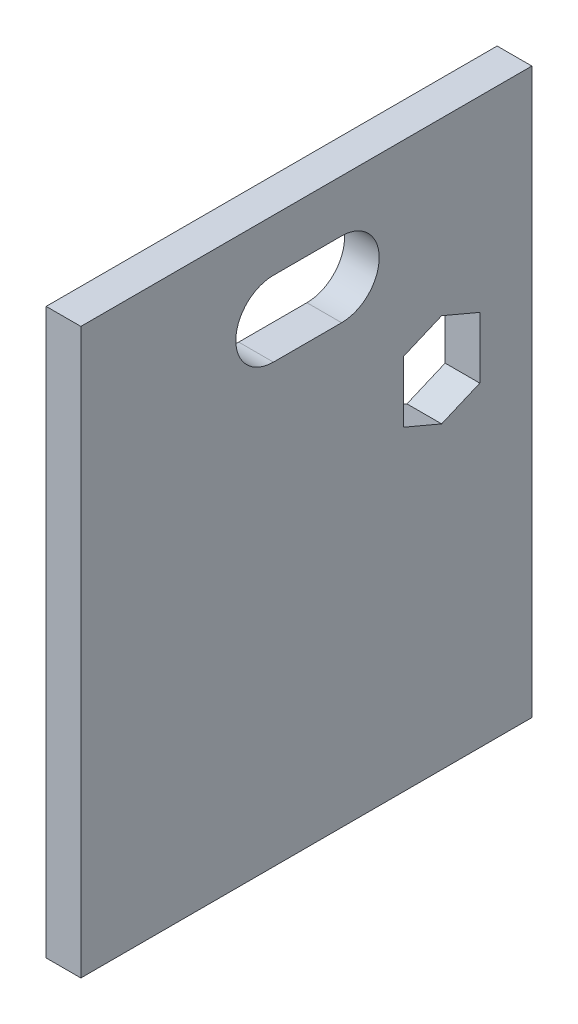
ISO-10303-21;
HEADER;
FILE_DESCRIPTION(('STEP AP214'),'2;1');
FILE_NAME('part.step','',(''),(''),'','','');
FILE_SCHEMA(('AUTOMOTIVE_DESIGN { 1 0 10303 214 1 1 1 1 }'));
ENDSEC;
DATA;
#1=APPLICATION_CONTEXT('core data for automotive mechanical design processes');
#2=APPLICATION_PROTOCOL_DEFINITION('international standard','automotive_design',2000,#1);
#3=PRODUCT_CONTEXT('',#1,'mechanical');
#4=PRODUCT('Part','Part','',(#3));
#5=PRODUCT_RELATED_PRODUCT_CATEGORY('part','',(#4));
#6=PRODUCT_DEFINITION_FORMATION('','',#4);
#7=PRODUCT_DEFINITION_CONTEXT('part definition',#1,'design');
#8=PRODUCT_DEFINITION('design','',#6,#7);
#9=PRODUCT_DEFINITION_SHAPE('','',#8);
#10=(LENGTH_UNIT() NAMED_UNIT(*) SI_UNIT(.MILLI.,.METRE.));
#11=(NAMED_UNIT(*) PLANE_ANGLE_UNIT() SI_UNIT($,.RADIAN.));
#12=(NAMED_UNIT(*) SI_UNIT($,.STERADIAN.) SOLID_ANGLE_UNIT());
#13=UNCERTAINTY_MEASURE_WITH_UNIT(LENGTH_MEASURE(1.E-05),#10,'distance_accuracy_value','');
#14=(GEOMETRIC_REPRESENTATION_CONTEXT(3) GLOBAL_UNCERTAINTY_ASSIGNED_CONTEXT((#13)) GLOBAL_UNIT_ASSIGNED_CONTEXT((#10,
#11,#12)) REPRESENTATION_CONTEXT('',''));
#15=CARTESIAN_POINT('',(0.,0.,0.));
#16=DIRECTION('',(0.,0.,1.));
#17=DIRECTION('',(1.,0.,0.));
#18=AXIS2_PLACEMENT_3D('',#15,#16,#17);
#19=CARTESIAN_POINT('',(15.,158.091828793774,67.0692607003891));
#20=DIRECTION('',(0.,0.920581781875257,0.39054984685617));
#21=DIRECTION('',(0.,-0.39054984685617,0.920581781875257));
#22=AXIS2_PLACEMENT_3D('',#19,#20,#21);
#23=PLANE('',#22);
#24=DIRECTION('',(0.,0.39054984685617,-0.920581781875257));
#25=VECTOR('',#24,1.);
#26=CARTESIAN_POINT('',(0.,158.091828793774,67.0692607003891));
#27=LINE('',#26,#25);
#28=CARTESIAN_POINT('',(0.,163.,55.5));
#29=VERTEX_POINT('',#28);
#30=CARTESIAN_POINT('',(0.,170.,39.));
#31=VERTEX_POINT('',#30);
#32=EDGE_CURVE('E216',#29,#31,#27,.T.);
#33=ORIENTED_EDGE('',*,*,#32,.T.);
#34=DIRECTION('',(-1.,0.,0.));
#35=VECTOR('',#34,1.);
#36=CARTESIAN_POINT('',(15.,170.,39.));
#37=LINE('',#36,#35);
#38=CARTESIAN_POINT('',(15.,170.,39.));
#39=VERTEX_POINT('',#38);
#40=EDGE_CURVE('E11',#39,#31,#37,.T.);
#41=ORIENTED_EDGE('',*,*,#40,.F.);
#42=DIRECTION('',(0.,0.39054984685617,-0.920581781875257));
#43=VECTOR('',#42,1.);
#44=CARTESIAN_POINT('',(15.,158.091828793774,67.0692607003891));
#45=LINE('',#44,#43);
#46=CARTESIAN_POINT('',(15.,163.,55.5));
#47=VERTEX_POINT('',#46);
#48=EDGE_CURVE('E311',#47,#39,#45,.T.);
#49=ORIENTED_EDGE('',*,*,#48,.F.);
#50=DIRECTION('',(-1.,0.,0.));
#51=VECTOR('',#50,1.);
#52=CARTESIAN_POINT('',(15.,163.,55.5));
#53=LINE('',#52,#51);
#54=EDGE_CURVE('E236',#47,#29,#53,.T.);
#55=ORIENTED_EDGE('',*,*,#54,.T.);
#56=EDGE_LOOP('',(#33,#41,#49,#55));
#57=FACE_BOUND('',#56,.T.);
#58=ADVANCED_FACE('F45',(#57),#23,.F.);
#59=CARTESIAN_POINT('',(15.,130.048249027237,-55.1719844357977));
#60=DIRECTION('',(0.,0.920581781875257,-0.39054984685617));
#61=DIRECTION('',(0.,0.39054984685617,0.920581781875257));
#62=AXIS2_PLACEMENT_3D('',#59,#60,#61);
#63=PLANE('',#62);
#64=DIRECTION('',(0.,-0.39054984685617,-0.920581781875257));
#65=VECTOR('',#64,1.);
#66=CARTESIAN_POINT('',(0.,130.048249027237,-55.1719844357977));
#67=LINE('',#66,#65);
#68=CARTESIAN_POINT('',(0.,163.,22.5));
#69=VERTEX_POINT('',#68);
#70=EDGE_CURVE('E220',#31,#69,#67,.T.);
#71=ORIENTED_EDGE('',*,*,#70,.T.);
#72=DIRECTION('',(-1.,0.,0.));
#73=VECTOR('',#72,1.);
#74=CARTESIAN_POINT('',(15.,163.,22.5));
#75=LINE('',#74,#73);
#76=CARTESIAN_POINT('',(15.,163.,22.5));
#77=VERTEX_POINT('',#76);
#78=EDGE_CURVE('E56',#77,#69,#75,.T.);
#79=ORIENTED_EDGE('',*,*,#78,.F.);
#80=DIRECTION('',(0.,-0.39054984685617,-0.920581781875257));
#81=VECTOR('',#80,1.);
#82=CARTESIAN_POINT('',(15.,130.048249027237,-55.1719844357977));
#83=LINE('',#82,#81);
#84=EDGE_CURVE('E314',#39,#77,#83,.T.);
#85=ORIENTED_EDGE('',*,*,#84,.F.);
#86=ORIENTED_EDGE('',*,*,#40,.T.);
#87=EDGE_LOOP('',(#71,#79,#85,#86));
#88=FACE_BOUND('',#87,.T.);
#89=ADVANCED_FACE('F339',(#88),#63,.F.);
#90=CARTESIAN_POINT('',(15.,0.,22.5));
#91=DIRECTION('',(0.,0.,1.));
#92=DIRECTION('',(1.,0.,0.));
#93=AXIS2_PLACEMENT_3D('',#90,#91,#92);
#94=PLANE('',#93);
#95=DIRECTION('',(0.,1.,0.));
#96=VECTOR('',#95,1.);
#97=CARTESIAN_POINT('',(0.,0.,22.5));
#98=LINE('',#97,#96);
#99=CARTESIAN_POINT('',(0.,136.5,22.5));
#100=VERTEX_POINT('',#99);
#101=EDGE_CURVE('E224',#100,#69,#98,.T.);
#102=ORIENTED_EDGE('',*,*,#101,.F.);
#103=DIRECTION('',(-1.,0.,0.));
#104=VECTOR('',#103,1.);
#105=CARTESIAN_POINT('',(15.,136.5,22.5));
#106=LINE('',#105,#104);
#107=CARTESIAN_POINT('',(15.,136.5,22.5));
#108=VERTEX_POINT('',#107);
#109=EDGE_CURVE('E167',#108,#100,#106,.T.);
#110=ORIENTED_EDGE('',*,*,#109,.F.);
#111=DIRECTION('',(0.,1.,0.));
#112=VECTOR('',#111,1.);
#113=CARTESIAN_POINT('',(15.,0.,22.5));
#114=LINE('',#113,#112);
#115=EDGE_CURVE('E173',#108,#77,#114,.T.);
#116=ORIENTED_EDGE('',*,*,#115,.T.);
#117=ORIENTED_EDGE('',*,*,#78,.T.);
#118=EDGE_LOOP('',(#102,#110,#116,#117));
#119=FACE_BOUND('',#118,.T.);
#120=ADVANCED_FACE('F319',(#119),#94,.T.);
#121=CARTESIAN_POINT('',(15.,123.769260700389,52.5081712062257));
#122=DIRECTION('',(0.,0.920581781875257,0.39054984685617));
#123=DIRECTION('',(0.,-0.39054984685617,0.920581781875257));
#124=AXIS2_PLACEMENT_3D('',#121,#122,#123);
#125=PLANE('',#124);
#126=DIRECTION('',(0.,0.39054984685617,-0.920581781875257));
#127=VECTOR('',#126,1.);
#128=CARTESIAN_POINT('',(0.,123.769260700389,52.5081712062257));
#129=LINE('',#128,#127);
#130=CARTESIAN_POINT('',(0.,129.5,39.));
#131=VERTEX_POINT('',#130);
#132=EDGE_CURVE('E161',#131,#100,#129,.T.);
#133=ORIENTED_EDGE('',*,*,#132,.F.);
#134=DIRECTION('',(-1.,0.,0.));
#135=VECTOR('',#134,1.);
#136=CARTESIAN_POINT('',(15.,129.5,39.));
#137=LINE('',#136,#135);
#138=CARTESIAN_POINT('',(15.,129.5,39.));
#139=VERTEX_POINT('',#138);
#140=EDGE_CURVE('E156',#139,#131,#137,.T.);
#141=ORIENTED_EDGE('',*,*,#140,.F.);
#142=DIRECTION('',(0.,0.39054984685617,-0.920581781875257));
#143=VECTOR('',#142,1.);
#144=CARTESIAN_POINT('',(15.,123.769260700389,52.5081712062257));
#145=LINE('',#144,#143);
#146=EDGE_CURVE('E159',#139,#108,#145,.T.);
#147=ORIENTED_EDGE('',*,*,#146,.T.);
#148=ORIENTED_EDGE('',*,*,#109,.T.);
#149=EDGE_LOOP('',(#133,#141,#147,#148));
#150=FACE_BOUND('',#149,.T.);
#151=ADVANCED_FACE('F158',(#150),#125,.T.);
#152=CARTESIAN_POINT('',(15.,95.7256809338521,-40.6108949416342));
#153=DIRECTION('',(0.,0.920581781875257,-0.39054984685617));
#154=DIRECTION('',(0.,0.39054984685617,0.920581781875257));
#155=AXIS2_PLACEMENT_3D('',#152,#153,#154);
#156=PLANE('',#155);
#157=DIRECTION('',(0.,-0.39054984685617,-0.920581781875257));
#158=VECTOR('',#157,1.);
#159=CARTESIAN_POINT('',(0.,95.7256809338521,-40.6108949416342));
#160=LINE('',#159,#158);
#161=CARTESIAN_POINT('',(0.,136.5,55.5));
#162=VERTEX_POINT('',#161);
#163=EDGE_CURVE('E230',#162,#131,#160,.T.);
#164=ORIENTED_EDGE('',*,*,#163,.F.);
#165=DIRECTION('',(-1.,0.,0.));
#166=VECTOR('',#165,1.);
#167=CARTESIAN_POINT('',(15.,136.5,55.5));
#168=LINE('',#167,#166);
#169=CARTESIAN_POINT('',(15.,136.5,55.5));
#170=VERTEX_POINT('',#169);
#171=EDGE_CURVE('E111',#170,#162,#168,.T.);
#172=ORIENTED_EDGE('',*,*,#171,.F.);
#173=DIRECTION('',(0.,-0.39054984685617,-0.920581781875257));
#174=VECTOR('',#173,1.);
#175=CARTESIAN_POINT('',(15.,95.7256809338521,-40.6108949416342));
#176=LINE('',#175,#174);
#177=EDGE_CURVE('E171',#170,#139,#176,.T.);
#178=ORIENTED_EDGE('',*,*,#177,.T.);
#179=ORIENTED_EDGE('',*,*,#140,.T.);
#180=EDGE_LOOP('',(#164,#172,#178,#179));
#181=FACE_BOUND('',#180,.T.);
#182=ADVANCED_FACE('F176',(#181),#156,.T.);
#183=CARTESIAN_POINT('',(15.,0.,0.));
#184=DIRECTION('',(0.,0.,1.));
#185=DIRECTION('',(1.,0.,0.));
#186=AXIS2_PLACEMENT_3D('',#183,#184,#185);
#187=PLANE('',#186);
#188=DIRECTION('',(0.,1.,0.));
#189=VECTOR('',#188,1.);
#190=CARTESIAN_POINT('',(0.,0.,0.));
#191=LINE('',#190,#189);
#192=CARTESIAN_POINT('',(0.,0.,0.));
#193=VERTEX_POINT('',#192);
#194=CARTESIAN_POINT('',(0.,244.,0.));
#195=VERTEX_POINT('',#194);
#196=EDGE_CURVE('E200',#193,#195,#191,.T.);
#197=ORIENTED_EDGE('',*,*,#196,.T.);
#198=DIRECTION('',(-1.,0.,0.));
#199=VECTOR('',#198,1.);
#200=CARTESIAN_POINT('',(15.,244.,0.));
#201=LINE('',#200,#199);
#202=CARTESIAN_POINT('',(15.,244.,0.));
#203=VERTEX_POINT('',#202);
#204=EDGE_CURVE('E239',#203,#195,#201,.T.);
#205=ORIENTED_EDGE('',*,*,#204,.F.);
#206=DIRECTION('',(0.,1.,0.));
#207=VECTOR('',#206,1.);
#208=CARTESIAN_POINT('',(15.,0.,0.));
#209=LINE('',#208,#207);
#210=CARTESIAN_POINT('',(15.,0.,0.));
#211=VERTEX_POINT('',#210);
#212=EDGE_CURVE('E288',#211,#203,#209,.T.);
#213=ORIENTED_EDGE('',*,*,#212,.F.);
#214=DIRECTION('',(-1.,0.,0.));
#215=VECTOR('',#214,1.);
#216=CARTESIAN_POINT('',(15.,0.,0.));
#217=LINE('',#216,#215);
#218=EDGE_CURVE('E246',#211,#193,#217,.T.);
#219=ORIENTED_EDGE('',*,*,#218,.T.);
#220=EDGE_LOOP('',(#197,#205,#213,#219));
#221=FACE_BOUND('',#220,.T.);
#222=ADVANCED_FACE('F358',(#221),#187,.F.);
#223=CARTESIAN_POINT('',(15.,244.,0.));
#224=DIRECTION('',(0.,-1.,0.));
#225=DIRECTION('',(0.,0.,-1.));
#226=AXIS2_PLACEMENT_3D('',#223,#224,#225);
#227=PLANE('',#226);
#228=DIRECTION('',(0.,0.,1.));
#229=VECTOR('',#228,1.);
#230=CARTESIAN_POINT('',(0.,244.,0.));
#231=LINE('',#230,#229);
#232=CARTESIAN_POINT('',(0.,244.,195.));
#233=VERTEX_POINT('',#232);
#234=EDGE_CURVE('E204',#195,#233,#231,.T.);
#235=ORIENTED_EDGE('',*,*,#234,.T.);
#236=DIRECTION('',(-1.,0.,0.));
#237=VECTOR('',#236,1.);
#238=CARTESIAN_POINT('',(15.,244.,195.));
#239=LINE('',#238,#237);
#240=CARTESIAN_POINT('',(15.,244.,195.));
#241=VERTEX_POINT('',#240);
#242=EDGE_CURVE('E252',#241,#233,#239,.T.);
#243=ORIENTED_EDGE('',*,*,#242,.F.);
#244=DIRECTION('',(0.,0.,1.));
#245=VECTOR('',#244,1.);
#246=CARTESIAN_POINT('',(15.,244.,0.));
#247=LINE('',#246,#245);
#248=EDGE_CURVE('E300',#203,#241,#247,.T.);
#249=ORIENTED_EDGE('',*,*,#248,.F.);
#250=ORIENTED_EDGE('',*,*,#204,.T.);
#251=EDGE_LOOP('',(#235,#243,#249,#250));
#252=FACE_BOUND('',#251,.T.);
#253=ADVANCED_FACE('F354',(#252),#227,.F.);
#254=CARTESIAN_POINT('',(15.,0.,195.));
#255=DIRECTION('',(0.,0.,1.));
#256=DIRECTION('',(1.,0.,0.));
#257=AXIS2_PLACEMENT_3D('',#254,#255,#256);
#258=PLANE('',#257);
#259=DIRECTION('',(0.,1.,0.));
#260=VECTOR('',#259,1.);
#261=CARTESIAN_POINT('',(0.,0.,195.));
#262=LINE('',#261,#260);
#263=CARTESIAN_POINT('',(0.,0.,195.));
#264=VERTEX_POINT('',#263);
#265=EDGE_CURVE('E208',#264,#233,#262,.T.);
#266=ORIENTED_EDGE('',*,*,#265,.F.);
#267=DIRECTION('',(-1.,0.,0.));
#268=VECTOR('',#267,1.);
#269=CARTESIAN_POINT('',(15.,0.,195.));
#270=LINE('',#269,#268);
#271=CARTESIAN_POINT('',(15.,0.,195.));
#272=VERTEX_POINT('',#271);
#273=EDGE_CURVE('E249',#272,#264,#270,.T.);
#274=ORIENTED_EDGE('',*,*,#273,.F.);
#275=DIRECTION('',(0.,1.,0.));
#276=VECTOR('',#275,1.);
#277=CARTESIAN_POINT('',(15.,0.,195.));
#278=LINE('',#277,#276);
#279=EDGE_CURVE('E303',#272,#241,#278,.T.);
#280=ORIENTED_EDGE('',*,*,#279,.T.);
#281=ORIENTED_EDGE('',*,*,#242,.T.);
#282=EDGE_LOOP('',(#266,#274,#280,#281));
#283=FACE_BOUND('',#282,.T.);
#284=ADVANCED_FACE('F351',(#283),#258,.T.);
#285=CARTESIAN_POINT('',(15.,205.25,82.25));
#286=DIRECTION('',(-1.,0.,0.));
#287=DIRECTION('',(0.,0.,1.));
#288=AXIS2_PLACEMENT_3D('',#285,#286,#287);
#289=CYLINDRICAL_SURFACE('',#288,16.25);
#290=CARTESIAN_POINT('',(0.,205.25,82.25));
#291=DIRECTION('',(1.,0.,0.));
#292=DIRECTION('',(0.,0.,-1.));
#293=AXIS2_PLACEMENT_3D('',#290,#291,#292);
#294=CIRCLE('',#293,16.25);
#295=CARTESIAN_POINT('',(0.,189.,82.25));
#296=VERTEX_POINT('',#295);
#297=CARTESIAN_POINT('',(0.,221.5,82.25));
#298=VERTEX_POINT('',#297);
#299=EDGE_CURVE('E184',#296,#298,#294,.T.);
#300=ORIENTED_EDGE('',*,*,#299,.F.);
#301=DIRECTION('',(-1.,0.,0.));
#302=VECTOR('',#301,1.);
#303=CARTESIAN_POINT('',(15.,189.,82.25));
#304=LINE('',#303,#302);
#305=CARTESIAN_POINT('',(15.,189.,82.25));
#306=VERTEX_POINT('',#305);
#307=EDGE_CURVE('E49',#306,#296,#304,.T.);
#308=ORIENTED_EDGE('',*,*,#307,.F.);
#309=CARTESIAN_POINT('',(15.,205.25,82.25));
#310=DIRECTION('',(1.,0.,0.));
#311=DIRECTION('',(0.,0.,-1.));
#312=AXIS2_PLACEMENT_3D('',#309,#310,#311);
#313=CIRCLE('',#312,16.25);
#314=CARTESIAN_POINT('',(15.,221.5,82.25));
#315=VERTEX_POINT('',#314);
#316=EDGE_CURVE('E235',#306,#315,#313,.T.);
#317=ORIENTED_EDGE('',*,*,#316,.T.);
#318=DIRECTION('',(-1.,0.,0.));
#319=VECTOR('',#318,1.);
#320=CARTESIAN_POINT('',(15.,221.5,82.25));
#321=LINE('',#320,#319);
#322=EDGE_CURVE('E180',#315,#298,#321,.T.);
#323=ORIENTED_EDGE('',*,*,#322,.T.);
#324=EDGE_LOOP('',(#300,#308,#317,#323));
#325=FACE_BOUND('',#324,.T.);
#326=ADVANCED_FACE('F47',(#325),#289,.F.);
#327=CARTESIAN_POINT('',(15.,189.,0.));
#328=DIRECTION('',(0.,1.,0.));
#329=DIRECTION('',(0.,0.,1.));
#330=AXIS2_PLACEMENT_3D('',#327,#328,#329);
#331=PLANE('',#330);
#332=DIRECTION('',(0.,0.,-1.));
#333=VECTOR('',#332,1.);
#334=CARTESIAN_POINT('',(0.,189.,0.));
#335=LINE('',#334,#333);
#336=CARTESIAN_POINT('',(0.,189.,111.75));
#337=VERTEX_POINT('',#336);
#338=EDGE_CURVE('E188',#337,#296,#335,.T.);
#339=ORIENTED_EDGE('',*,*,#338,.F.);
#340=DIRECTION('',(-1.,0.,0.));
#341=VECTOR('',#340,1.);
#342=CARTESIAN_POINT('',(15.,189.,111.75));
#343=LINE('',#342,#341);
#344=CARTESIAN_POINT('',(15.,189.,111.75));
#345=VERTEX_POINT('',#344);
#346=EDGE_CURVE('E262',#345,#337,#343,.T.);
#347=ORIENTED_EDGE('',*,*,#346,.F.);
#348=DIRECTION('',(0.,0.,-1.));
#349=VECTOR('',#348,1.);
#350=CARTESIAN_POINT('',(15.,189.,0.));
#351=LINE('',#350,#349);
#352=EDGE_CURVE('E273',#345,#306,#351,.T.);
#353=ORIENTED_EDGE('',*,*,#352,.T.);
#354=ORIENTED_EDGE('',*,*,#307,.T.);
#355=EDGE_LOOP('',(#339,#347,#353,#354));
#356=FACE_BOUND('',#355,.T.);
#357=ADVANCED_FACE('F271',(#356),#331,.T.);
#358=CARTESIAN_POINT('',(15.,205.25,111.75));
#359=DIRECTION('',(-1.,0.,0.));
#360=DIRECTION('',(0.,0.,1.));
#361=AXIS2_PLACEMENT_3D('',#358,#359,#360);
#362=CYLINDRICAL_SURFACE('',#361,16.25);
#363=CARTESIAN_POINT('',(0.,205.25,111.75));
#364=DIRECTION('',(1.,0.,0.));
#365=DIRECTION('',(0.,0.,-1.));
#366=AXIS2_PLACEMENT_3D('',#363,#364,#365);
#367=CIRCLE('',#366,16.25);
#368=CARTESIAN_POINT('',(0.,221.5,111.75));
#369=VERTEX_POINT('',#368);
#370=EDGE_CURVE('E192',#369,#337,#367,.T.);
#371=ORIENTED_EDGE('',*,*,#370,.F.);
#372=DIRECTION('',(-1.,0.,0.));
#373=VECTOR('',#372,1.);
#374=CARTESIAN_POINT('',(15.,221.5,111.75));
#375=LINE('',#374,#373);
#376=CARTESIAN_POINT('',(15.,221.5,111.75));
#377=VERTEX_POINT('',#376);
#378=EDGE_CURVE('E260',#377,#369,#375,.T.);
#379=ORIENTED_EDGE('',*,*,#378,.F.);
#380=CARTESIAN_POINT('',(15.,205.25,111.75));
#381=DIRECTION('',(1.,0.,0.));
#382=DIRECTION('',(0.,0.,-1.));
#383=AXIS2_PLACEMENT_3D('',#380,#381,#382);
#384=CIRCLE('',#383,16.25);
#385=EDGE_CURVE('E282',#377,#345,#384,.T.);
#386=ORIENTED_EDGE('',*,*,#385,.T.);
#387=ORIENTED_EDGE('',*,*,#346,.T.);
#388=EDGE_LOOP('',(#371,#379,#386,#387));
#389=FACE_BOUND('',#388,.T.);
#390=ADVANCED_FACE('F279',(#389),#362,.F.);
#391=CARTESIAN_POINT('',(15.,0.,0.));
#392=DIRECTION('',(0.,-1.,0.));
#393=DIRECTION('',(0.,0.,-1.));
#394=AXIS2_PLACEMENT_3D('',#391,#392,#393);
#395=PLANE('',#394);
#396=DIRECTION('',(0.,0.,1.));
#397=VECTOR('',#396,1.);
#398=CARTESIAN_POINT('',(0.,0.,0.));
#399=LINE('',#398,#397);
#400=EDGE_CURVE('E212',#193,#264,#399,.T.);
#401=ORIENTED_EDGE('',*,*,#400,.F.);
#402=ORIENTED_EDGE('',*,*,#218,.F.);
#403=DIRECTION('',(0.,0.,1.));
#404=VECTOR('',#403,1.);
#405=CARTESIAN_POINT('',(15.,0.,0.));
#406=LINE('',#405,#404);
#407=EDGE_CURVE('E307',#211,#272,#406,.T.);
#408=ORIENTED_EDGE('',*,*,#407,.T.);
#409=ORIENTED_EDGE('',*,*,#273,.T.);
#410=EDGE_LOOP('',(#401,#402,#408,#409));
#411=FACE_BOUND('',#410,.T.);
#412=ADVANCED_FACE('F334',(#411),#395,.T.);
#413=CARTESIAN_POINT('',(15.,221.5,0.));
#414=DIRECTION('',(0.,1.,0.));
#415=DIRECTION('',(0.,0.,1.));
#416=AXIS2_PLACEMENT_3D('',#413,#414,#415);
#417=PLANE('',#416);
#418=DIRECTION('',(0.,0.,-1.));
#419=VECTOR('',#418,1.);
#420=CARTESIAN_POINT('',(0.,221.5,0.));
#421=LINE('',#420,#419);
#422=EDGE_CURVE('E196',#369,#298,#421,.T.);
#423=ORIENTED_EDGE('',*,*,#422,.T.);
#424=ORIENTED_EDGE('',*,*,#322,.F.);
#425=DIRECTION('',(0.,0.,-1.));
#426=VECTOR('',#425,1.);
#427=CARTESIAN_POINT('',(15.,221.5,0.));
#428=LINE('',#427,#426);
#429=EDGE_CURVE('E284',#377,#315,#428,.T.);
#430=ORIENTED_EDGE('',*,*,#429,.F.);
#431=ORIENTED_EDGE('',*,*,#378,.T.);
#432=EDGE_LOOP('',(#423,#424,#430,#431));
#433=FACE_BOUND('',#432,.T.);
#434=ADVANCED_FACE('F285',(#433),#417,.F.);
#435=CARTESIAN_POINT('',(15.,0.,55.5));
#436=DIRECTION('',(0.,0.,1.));
#437=DIRECTION('',(1.,0.,0.));
#438=AXIS2_PLACEMENT_3D('',#435,#436,#437);
#439=PLANE('',#438);
#440=DIRECTION('',(0.,1.,0.));
#441=VECTOR('',#440,1.);
#442=CARTESIAN_POINT('',(0.,0.,55.5));
#443=LINE('',#442,#441);
#444=EDGE_CURVE('E114',#162,#29,#443,.T.);
#445=ORIENTED_EDGE('',*,*,#444,.T.);
#446=ORIENTED_EDGE('',*,*,#54,.F.);
#447=DIRECTION('',(0.,1.,0.));
#448=VECTOR('',#447,1.);
#449=CARTESIAN_POINT('',(15.,0.,55.5));
#450=LINE('',#449,#448);
#451=EDGE_CURVE('E65',#170,#47,#450,.T.);
#452=ORIENTED_EDGE('',*,*,#451,.F.);
#453=ORIENTED_EDGE('',*,*,#171,.T.);
#454=EDGE_LOOP('',(#445,#446,#452,#453));
#455=FACE_BOUND('',#454,.T.);
#456=ADVANCED_FACE('F326',(#455),#439,.F.);
#457=CARTESIAN_POINT('',(15.,0.,0.));
#458=DIRECTION('',(1.,0.,0.));
#459=DIRECTION('',(0.,0.,-1.));
#460=AXIS2_PLACEMENT_3D('',#457,#458,#459);
#461=PLANE('',#460);
#462=ORIENTED_EDGE('',*,*,#316,.F.);
#463=ORIENTED_EDGE('',*,*,#352,.F.);
#464=ORIENTED_EDGE('',*,*,#385,.F.);
#465=ORIENTED_EDGE('',*,*,#429,.T.);
#466=EDGE_LOOP('',(#462,#463,#464,#465));
#467=FACE_BOUND('',#466,.T.);
#468=ORIENTED_EDGE('',*,*,#212,.T.);
#469=ORIENTED_EDGE('',*,*,#248,.T.);
#470=ORIENTED_EDGE('',*,*,#279,.F.);
#471=ORIENTED_EDGE('',*,*,#407,.F.);
#472=EDGE_LOOP('',(#468,#469,#470,#471));
#473=FACE_BOUND('',#472,.T.);
#474=ORIENTED_EDGE('',*,*,#48,.T.);
#475=ORIENTED_EDGE('',*,*,#84,.T.);
#476=ORIENTED_EDGE('',*,*,#115,.F.);
#477=ORIENTED_EDGE('',*,*,#146,.F.);
#478=ORIENTED_EDGE('',*,*,#177,.F.);
#479=ORIENTED_EDGE('',*,*,#451,.T.);
#480=EDGE_LOOP('',(#474,#475,#476,#477,#478,#479));
#481=FACE_BOUND('',#480,.T.);
#482=ADVANCED_FACE('F170',(#467,#473,#481),#461,.T.);
#483=CARTESIAN_POINT('',(0.,0.,0.));
#484=DIRECTION('',(1.,0.,0.));
#485=DIRECTION('',(0.,0.,-1.));
#486=AXIS2_PLACEMENT_3D('',#483,#484,#485);
#487=PLANE('',#486);
#488=ORIENTED_EDGE('',*,*,#299,.T.);
#489=ORIENTED_EDGE('',*,*,#422,.F.);
#490=ORIENTED_EDGE('',*,*,#370,.T.);
#491=ORIENTED_EDGE('',*,*,#338,.T.);
#492=EDGE_LOOP('',(#488,#489,#490,#491));
#493=FACE_BOUND('',#492,.T.);
#494=ORIENTED_EDGE('',*,*,#196,.F.);
#495=ORIENTED_EDGE('',*,*,#400,.T.);
#496=ORIENTED_EDGE('',*,*,#265,.T.);
#497=ORIENTED_EDGE('',*,*,#234,.F.);
#498=EDGE_LOOP('',(#494,#495,#496,#497));
#499=FACE_BOUND('',#498,.T.);
#500=ORIENTED_EDGE('',*,*,#32,.F.);
#501=ORIENTED_EDGE('',*,*,#444,.F.);
#502=ORIENTED_EDGE('',*,*,#163,.T.);
#503=ORIENTED_EDGE('',*,*,#132,.T.);
#504=ORIENTED_EDGE('',*,*,#101,.T.);
#505=ORIENTED_EDGE('',*,*,#70,.F.);
#506=EDGE_LOOP('',(#500,#501,#502,#503,#504,#505));
#507=FACE_BOUND('',#506,.T.);
#508=ADVANCED_FACE('F277',(#493,#499,#507),#487,.F.);
#509=CLOSED_SHELL('',(#58,#89,#120,#151,#182,#222,#253,#284,#326,#357,#390,#412,#434,#456,#482,#508));
#510=MANIFOLD_SOLID_BREP('B2',#509);
#511=ADVANCED_BREP_SHAPE_REPRESENTATION('',(#18,#510),#14);
#512=SHAPE_DEFINITION_REPRESENTATION(#9,#511);
ENDSEC;
END-ISO-10303-21;
